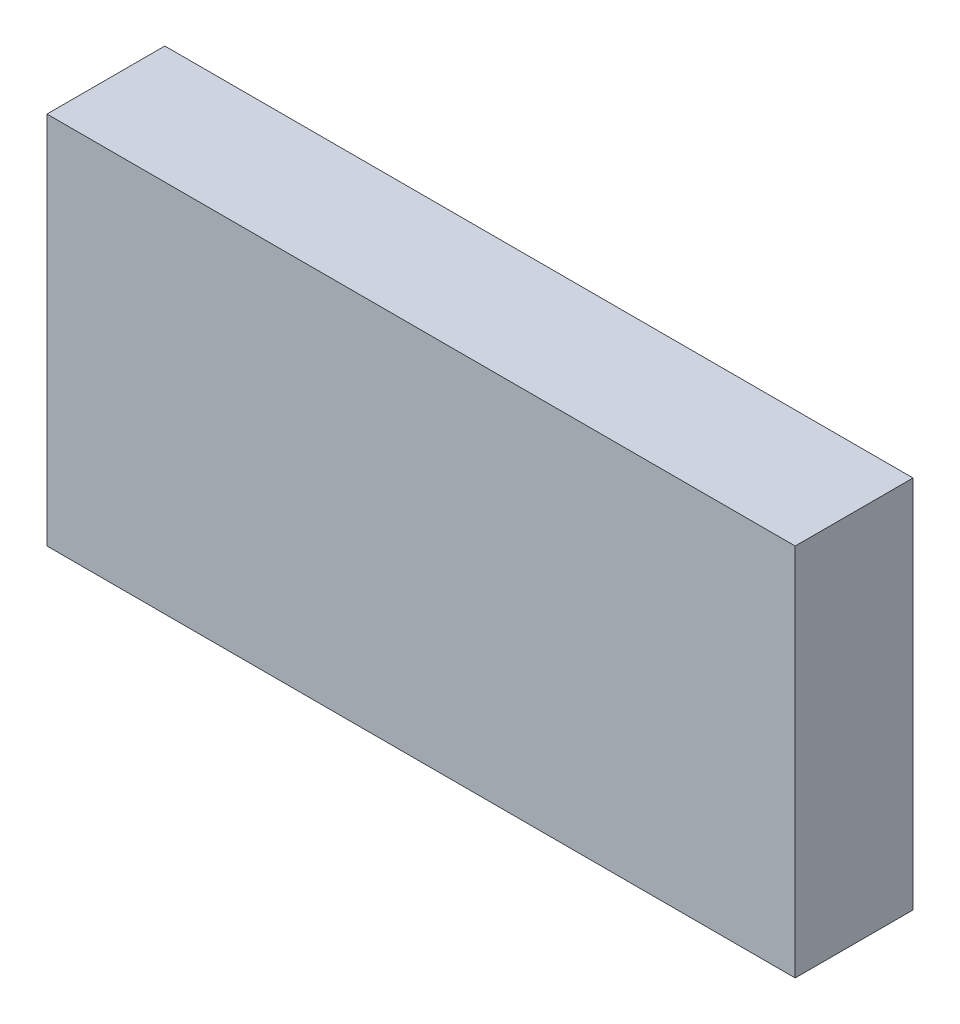
ISO-10303-21;
HEADER;
FILE_DESCRIPTION(('STEP AP214'),'2;1');
FILE_NAME('part.step','',(''),(''),'','','');
FILE_SCHEMA(('AUTOMOTIVE_DESIGN { 1 0 10303 214 1 1 1 1 }'));
ENDSEC;
DATA;
#1=APPLICATION_CONTEXT('core data for automotive mechanical design processes');
#2=APPLICATION_PROTOCOL_DEFINITION('international standard','automotive_design',2000,#1);
#3=PRODUCT_CONTEXT('',#1,'mechanical');
#4=PRODUCT('Part','Part','',(#3));
#5=PRODUCT_RELATED_PRODUCT_CATEGORY('part','',(#4));
#6=PRODUCT_DEFINITION_FORMATION('','',#4);
#7=PRODUCT_DEFINITION_CONTEXT('part definition',#1,'design');
#8=PRODUCT_DEFINITION('design','',#6,#7);
#9=PRODUCT_DEFINITION_SHAPE('','',#8);
#10=(LENGTH_UNIT() NAMED_UNIT(*) SI_UNIT(.MILLI.,.METRE.));
#11=(NAMED_UNIT(*) PLANE_ANGLE_UNIT() SI_UNIT($,.RADIAN.));
#12=(NAMED_UNIT(*) SI_UNIT($,.STERADIAN.) SOLID_ANGLE_UNIT());
#13=UNCERTAINTY_MEASURE_WITH_UNIT(LENGTH_MEASURE(1.E-05),#10,'distance_accuracy_value','');
#14=(GEOMETRIC_REPRESENTATION_CONTEXT(3) GLOBAL_UNCERTAINTY_ASSIGNED_CONTEXT((#13)) GLOBAL_UNIT_ASSIGNED_CONTEXT((#10,
#11,#12)) REPRESENTATION_CONTEXT('',''));
#15=CARTESIAN_POINT('',(0.,0.,0.));
#16=DIRECTION('',(0.,0.,1.));
#17=DIRECTION('',(1.,0.,0.));
#18=AXIS2_PLACEMENT_3D('',#15,#16,#17);
#19=CARTESIAN_POINT('',(0.,0.,6.3));
#20=DIRECTION('',(1.,0.,0.));
#21=DIRECTION('',(0.,0.,-1.));
#22=AXIS2_PLACEMENT_3D('',#19,#20,#21);
#23=PLANE('',#22);
#24=DIRECTION('',(0.,-1.,0.));
#25=VECTOR('',#24,1.);
#26=CARTESIAN_POINT('',(0.,0.,0.));
#27=LINE('',#26,#25);
#28=CARTESIAN_POINT('',(0.,20.,0.));
#29=VERTEX_POINT('',#28);
#30=CARTESIAN_POINT('',(0.,0.,0.));
#31=VERTEX_POINT('',#30);
#32=EDGE_CURVE('E106',#29,#31,#27,.T.);
#33=ORIENTED_EDGE('',*,*,#32,.T.);
#34=DIRECTION('',(0.,0.,-1.));
#35=VECTOR('',#34,1.);
#36=CARTESIAN_POINT('',(0.,0.,6.3));
#37=LINE('',#36,#35);
#38=CARTESIAN_POINT('',(0.,0.,6.3));
#39=VERTEX_POINT('',#38);
#40=EDGE_CURVE('E11',#39,#31,#37,.T.);
#41=ORIENTED_EDGE('',*,*,#40,.F.);
#42=DIRECTION('',(0.,-1.,0.));
#43=VECTOR('',#42,1.);
#44=CARTESIAN_POINT('',(0.,0.,6.3));
#45=LINE('',#44,#43);
#46=CARTESIAN_POINT('',(0.,20.,6.3));
#47=VERTEX_POINT('',#46);
#48=EDGE_CURVE('E92',#47,#39,#45,.T.);
#49=ORIENTED_EDGE('',*,*,#48,.F.);
#50=DIRECTION('',(0.,0.,-1.));
#51=VECTOR('',#50,1.);
#52=CARTESIAN_POINT('',(0.,20.,6.3));
#53=LINE('',#52,#51);
#54=EDGE_CURVE('E105',#47,#29,#53,.T.);
#55=ORIENTED_EDGE('',*,*,#54,.T.);
#56=EDGE_LOOP('',(#33,#41,#49,#55));
#57=FACE_BOUND('',#56,.T.);
#58=ADVANCED_FACE('F43',(#57),#23,.F.);
#59=CARTESIAN_POINT('',(0.,0.,6.3));
#60=DIRECTION('',(0.,1.,0.));
#61=DIRECTION('',(0.,0.,1.));
#62=AXIS2_PLACEMENT_3D('',#59,#60,#61);
#63=PLANE('',#62);
#64=DIRECTION('',(1.,0.,0.));
#65=VECTOR('',#64,1.);
#66=CARTESIAN_POINT('',(0.,0.,0.));
#67=LINE('',#66,#65);
#68=CARTESIAN_POINT('',(40.,0.,0.));
#69=VERTEX_POINT('',#68);
#70=EDGE_CURVE('E97',#31,#69,#67,.T.);
#71=ORIENTED_EDGE('',*,*,#70,.T.);
#72=DIRECTION('',(0.,0.,-1.));
#73=VECTOR('',#72,1.);
#74=CARTESIAN_POINT('',(40.,0.,6.3));
#75=LINE('',#74,#73);
#76=CARTESIAN_POINT('',(40.,0.,6.3));
#77=VERTEX_POINT('',#76);
#78=EDGE_CURVE('E51',#77,#69,#75,.T.);
#79=ORIENTED_EDGE('',*,*,#78,.F.);
#80=DIRECTION('',(1.,0.,0.));
#81=VECTOR('',#80,1.);
#82=CARTESIAN_POINT('',(0.,0.,6.3));
#83=LINE('',#82,#81);
#84=EDGE_CURVE('E87',#39,#77,#83,.T.);
#85=ORIENTED_EDGE('',*,*,#84,.F.);
#86=ORIENTED_EDGE('',*,*,#40,.T.);
#87=EDGE_LOOP('',(#71,#79,#85,#86));
#88=FACE_BOUND('',#87,.T.);
#89=ADVANCED_FACE('F100',(#88),#63,.F.);
#90=CARTESIAN_POINT('',(40.,0.,6.3));
#91=DIRECTION('',(-1.,0.,0.));
#92=DIRECTION('',(0.,0.,1.));
#93=AXIS2_PLACEMENT_3D('',#90,#91,#92);
#94=PLANE('',#93);
#95=DIRECTION('',(0.,1.,0.));
#96=VECTOR('',#95,1.);
#97=CARTESIAN_POINT('',(40.,0.,0.));
#98=LINE('',#97,#96);
#99=CARTESIAN_POINT('',(40.,20.,0.));
#100=VERTEX_POINT('',#99);
#101=EDGE_CURVE('E78',#69,#100,#98,.T.);
#102=ORIENTED_EDGE('',*,*,#101,.T.);
#103=DIRECTION('',(0.,0.,-1.));
#104=VECTOR('',#103,1.);
#105=CARTESIAN_POINT('',(40.,20.,6.3));
#106=LINE('',#105,#104);
#107=CARTESIAN_POINT('',(40.,20.,6.3));
#108=VERTEX_POINT('',#107);
#109=EDGE_CURVE('E98',#108,#100,#106,.T.);
#110=ORIENTED_EDGE('',*,*,#109,.F.);
#111=DIRECTION('',(0.,1.,0.));
#112=VECTOR('',#111,1.);
#113=CARTESIAN_POINT('',(40.,0.,6.3));
#114=LINE('',#113,#112);
#115=EDGE_CURVE('E95',#77,#108,#114,.T.);
#116=ORIENTED_EDGE('',*,*,#115,.F.);
#117=ORIENTED_EDGE('',*,*,#78,.T.);
#118=EDGE_LOOP('',(#102,#110,#116,#117));
#119=FACE_BOUND('',#118,.T.);
#120=ADVANCED_FACE('F99',(#119),#94,.F.);
#121=CARTESIAN_POINT('',(0.,20.,6.3));
#122=DIRECTION('',(0.,-1.,0.));
#123=DIRECTION('',(0.,0.,-1.));
#124=AXIS2_PLACEMENT_3D('',#121,#122,#123);
#125=PLANE('',#124);
#126=DIRECTION('',(-1.,0.,0.));
#127=VECTOR('',#126,1.);
#128=CARTESIAN_POINT('',(0.,20.,0.));
#129=LINE('',#128,#127);
#130=EDGE_CURVE('E85',#100,#29,#129,.T.);
#131=ORIENTED_EDGE('',*,*,#130,.T.);
#132=ORIENTED_EDGE('',*,*,#54,.F.);
#133=DIRECTION('',(-1.,0.,0.));
#134=VECTOR('',#133,1.);
#135=CARTESIAN_POINT('',(0.,20.,6.3));
#136=LINE('',#135,#134);
#137=EDGE_CURVE('E56',#108,#47,#136,.T.);
#138=ORIENTED_EDGE('',*,*,#137,.F.);
#139=ORIENTED_EDGE('',*,*,#109,.T.);
#140=EDGE_LOOP('',(#131,#132,#138,#139));
#141=FACE_BOUND('',#140,.T.);
#142=ADVANCED_FACE('F111',(#141),#125,.F.);
#143=CARTESIAN_POINT('',(0.,0.,6.3));
#144=DIRECTION('',(0.,0.,-1.));
#145=DIRECTION('',(-1.,0.,0.));
#146=AXIS2_PLACEMENT_3D('',#143,#144,#145);
#147=PLANE('',#146);
#148=ORIENTED_EDGE('',*,*,#48,.T.);
#149=ORIENTED_EDGE('',*,*,#84,.T.);
#150=ORIENTED_EDGE('',*,*,#115,.T.);
#151=ORIENTED_EDGE('',*,*,#137,.T.);
#152=EDGE_LOOP('',(#148,#149,#150,#151));
#153=FACE_BOUND('',#152,.T.);
#154=ADVANCED_FACE('F89',(#153),#147,.F.);
#155=CARTESIAN_POINT('',(0.,0.,0.));
#156=DIRECTION('',(0.,0.,-1.));
#157=DIRECTION('',(-1.,0.,0.));
#158=AXIS2_PLACEMENT_3D('',#155,#156,#157);
#159=PLANE('',#158);
#160=ORIENTED_EDGE('',*,*,#32,.F.);
#161=ORIENTED_EDGE('',*,*,#130,.F.);
#162=ORIENTED_EDGE('',*,*,#101,.F.);
#163=ORIENTED_EDGE('',*,*,#70,.F.);
#164=EDGE_LOOP('',(#160,#161,#162,#163));
#165=FACE_BOUND('',#164,.T.);
#166=ADVANCED_FACE('F116',(#165),#159,.T.);
#167=CLOSED_SHELL('',(#58,#89,#120,#142,#154,#166));
#168=MANIFOLD_SOLID_BREP('B2',#167);
#169=ADVANCED_BREP_SHAPE_REPRESENTATION('',(#18,#168),#14);
#170=SHAPE_DEFINITION_REPRESENTATION(#9,#169);
ENDSEC;
END-ISO-10303-21;
